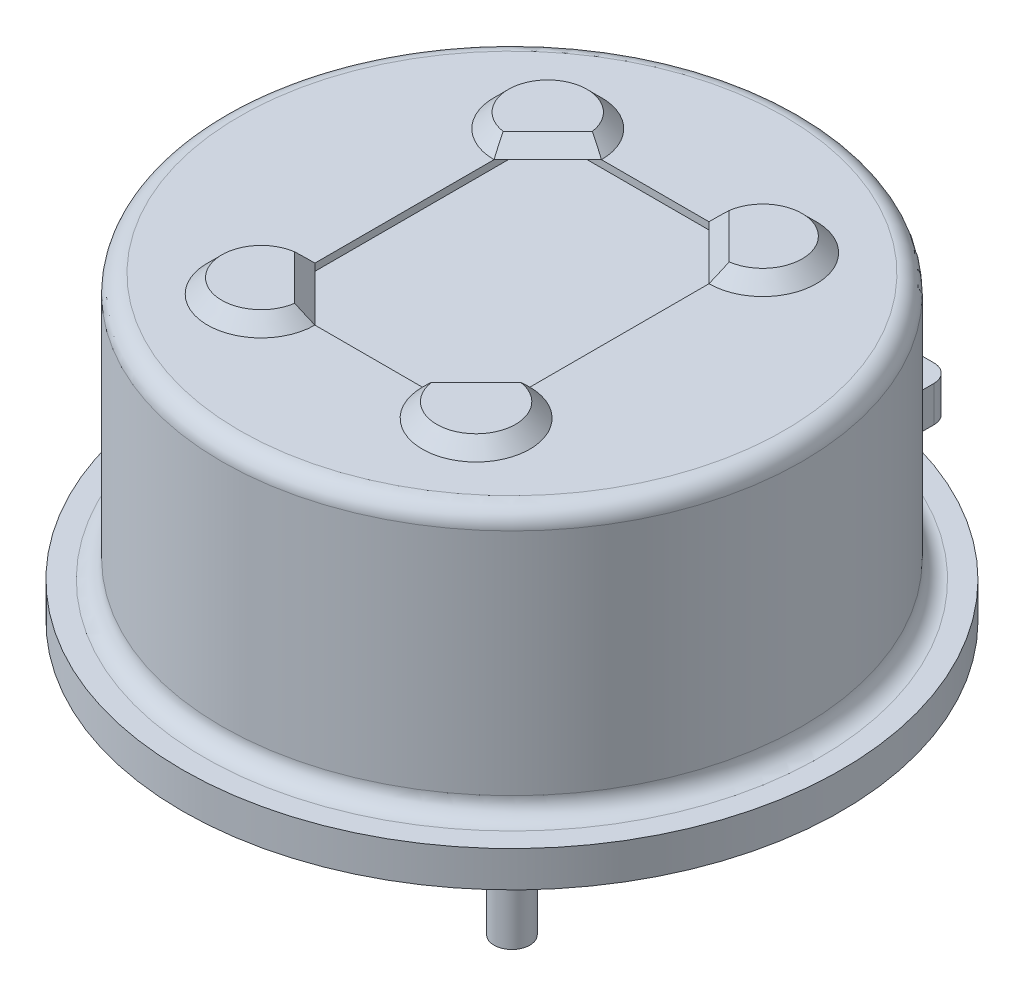
ISO-10303-21;
HEADER;
FILE_DESCRIPTION(('STEP AP214'),'2;1');
FILE_NAME('part.step','',(''),(''),'','','');
FILE_SCHEMA(('AUTOMOTIVE_DESIGN { 1 0 10303 214 1 1 1 1 }'));
ENDSEC;
DATA;
#1=APPLICATION_CONTEXT('core data for automotive mechanical design processes');
#2=APPLICATION_PROTOCOL_DEFINITION('international standard','automotive_design',2000,#1);
#3=PRODUCT_CONTEXT('',#1,'mechanical');
#4=PRODUCT('Part','Part','',(#3));
#5=PRODUCT_RELATED_PRODUCT_CATEGORY('part','',(#4));
#6=PRODUCT_DEFINITION_FORMATION('','',#4);
#7=PRODUCT_DEFINITION_CONTEXT('part definition',#1,'design');
#8=PRODUCT_DEFINITION('design','',#6,#7);
#9=PRODUCT_DEFINITION_SHAPE('','',#8);
#10=(LENGTH_UNIT() NAMED_UNIT(*) SI_UNIT(.MILLI.,.METRE.));
#11=(NAMED_UNIT(*) PLANE_ANGLE_UNIT() SI_UNIT($,.RADIAN.));
#12=(NAMED_UNIT(*) SI_UNIT($,.STERADIAN.) SOLID_ANGLE_UNIT());
#13=UNCERTAINTY_MEASURE_WITH_UNIT(LENGTH_MEASURE(1.E-05),#10,'distance_accuracy_value','');
#14=(GEOMETRIC_REPRESENTATION_CONTEXT(3) GLOBAL_UNCERTAINTY_ASSIGNED_CONTEXT((#13)) GLOBAL_UNIT_ASSIGNED_CONTEXT((#10,
#11,#12)) REPRESENTATION_CONTEXT('',''));
#15=CARTESIAN_POINT('',(0.,0.,0.));
#16=DIRECTION('',(0.,0.,1.));
#17=DIRECTION('',(1.,0.,0.));
#18=AXIS2_PLACEMENT_3D('',#15,#16,#17);
#19=CARTESIAN_POINT('',(0.,0.,0.));
#20=DIRECTION('',(0.,1.,0.));
#21=DIRECTION('',(0.,0.,1.));
#22=AXIS2_PLACEMENT_3D('',#19,#20,#21);
#23=PLANE('',#22);
#24=CARTESIAN_POINT('',(1.79605122421383,0.,1.79605122421383));
#25=DIRECTION('',(0.,1.,0.));
#26=DIRECTION('',(0.,0.,1.));
#27=AXIS2_PLACEMENT_3D('',#24,#25,#26);
#28=CIRCLE('',#27,0.250000000000001);
#29=CARTESIAN_POINT('',(1.79605122421383,0.,2.04605122421383));
#30=VERTEX_POINT('',#29);
#31=EDGE_CURVE('E44',#30,#30,#28,.F.);
#32=ORIENTED_EDGE('',*,*,#31,.F.);
#33=EDGE_LOOP('',(#32));
#34=FACE_BOUND('',#33,.T.);
#35=DIRECTION('',(0.,0.,-1.));
#36=VECTOR('',#35,1.);
#37=CARTESIAN_POINT('',(-0.575,0.,-4.56392101158642));
#38=LINE('',#37,#36);
#39=CARTESIAN_POINT('',(-0.575000000000001,0.,-4.56392101158642));
#40=VERTEX_POINT('',#39);
#41=CARTESIAN_POINT('',(-0.575,0.,-5.31392101158642));
#42=VERTEX_POINT('',#41);
#43=EDGE_CURVE('E193',#40,#42,#38,.T.);
#44=ORIENTED_EDGE('',*,*,#43,.T.);
#45=CARTESIAN_POINT('',(-0.325,0.,-5.31392101158642));
#46=DIRECTION('',(0.,1.,0.));
#47=DIRECTION('',(0.,0.,1.));
#48=AXIS2_PLACEMENT_3D('',#45,#46,#47);
#49=CIRCLE('',#48,0.25);
#50=CARTESIAN_POINT('',(-0.325,0.,-5.56392101158642));
#51=VERTEX_POINT('',#50);
#52=EDGE_CURVE('E373',#42,#51,#49,.F.);
#53=ORIENTED_EDGE('',*,*,#52,.T.);
#54=DIRECTION('',(1.,0.,0.));
#55=VECTOR('',#54,1.);
#56=CARTESIAN_POINT('',(-0.575,0.,-5.56392101158642));
#57=LINE('',#56,#55);
#58=CARTESIAN_POINT('',(0.325,0.,-5.56392101158642));
#59=VERTEX_POINT('',#58);
#60=EDGE_CURVE('E196',#51,#59,#57,.T.);
#61=ORIENTED_EDGE('',*,*,#60,.T.);
#62=CARTESIAN_POINT('',(0.325,0.,-5.31392101158642));
#63=DIRECTION('',(0.,1.,0.));
#64=DIRECTION('',(0.,0.,1.));
#65=AXIS2_PLACEMENT_3D('',#62,#63,#64);
#66=CIRCLE('',#65,0.25);
#67=CARTESIAN_POINT('',(0.575,0.,-5.31392101158642));
#68=VERTEX_POINT('',#67);
#69=EDGE_CURVE('E371',#59,#68,#66,.F.);
#70=ORIENTED_EDGE('',*,*,#69,.T.);
#71=DIRECTION('',(0.,0.,1.));
#72=VECTOR('',#71,1.);
#73=CARTESIAN_POINT('',(0.575,0.,-4.56392101158642));
#74=LINE('',#73,#72);
#75=CARTESIAN_POINT('',(0.575,0.,-4.56392101158642));
#76=VERTEX_POINT('',#75);
#77=EDGE_CURVE('E182',#68,#76,#74,.T.);
#78=ORIENTED_EDGE('',*,*,#77,.T.);
#79=CARTESIAN_POINT('',(0.,0.,0.));
#80=DIRECTION('',(0.,-1.,0.));
#81=DIRECTION('',(0.,0.,-1.));
#82=AXIS2_PLACEMENT_3D('',#79,#80,#81);
#83=CIRCLE('',#82,4.6);
#84=EDGE_CURVE('E174',#76,#40,#83,.T.);
#85=ORIENTED_EDGE('',*,*,#84,.T.);
#86=EDGE_LOOP('',(#44,#53,#61,#70,#78,#85));
#87=FACE_BOUND('',#86,.T.);
#88=CARTESIAN_POINT('',(-1.79605122421383,0.,-1.79605122421383));
#89=DIRECTION('',(0.,1.,0.));
#90=DIRECTION('',(0.,0.,1.));
#91=AXIS2_PLACEMENT_3D('',#88,#89,#90);
#92=CIRCLE('',#91,0.25);
#93=CARTESIAN_POINT('',(-1.79605122421383,0.,-1.54605122421383));
#94=VERTEX_POINT('',#93);
#95=EDGE_CURVE('E396',#94,#94,#92,.F.);
#96=ORIENTED_EDGE('',*,*,#95,.F.);
#97=EDGE_LOOP('',(#96));
#98=FACE_BOUND('',#97,.T.);
#99=CARTESIAN_POINT('',(-1.79605122421383,0.,1.79605122421383));
#100=DIRECTION('',(0.,1.,0.));
#101=DIRECTION('',(0.,0.,1.));
#102=AXIS2_PLACEMENT_3D('',#99,#100,#101);
#103=CIRCLE('',#102,0.25);
#104=CARTESIAN_POINT('',(-1.79605122421383,0.,2.04605122421383));
#105=VERTEX_POINT('',#104);
#106=EDGE_CURVE('E12',#105,#105,#103,.F.);
#107=ORIENTED_EDGE('',*,*,#106,.F.);
#108=EDGE_LOOP('',(#107));
#109=FACE_BOUND('',#108,.T.);
#110=ADVANCED_FACE('F35',(#34,#87,#98,#109),#23,.F.);
#111=CARTESIAN_POINT('',(0.,4.2,0.));
#112=DIRECTION('',(0.,-1.,0.));
#113=DIRECTION('',(0.,0.,-1.));
#114=AXIS2_PLACEMENT_3D('',#111,#112,#113);
#115=CYLINDRICAL_SURFACE('',#114,4.05);
#116=CARTESIAN_POINT('',(0.,3.95,0.));
#117=DIRECTION('',(0.,1.,0.));
#118=DIRECTION('',(0.,0.,1.));
#119=AXIS2_PLACEMENT_3D('',#116,#117,#118);
#120=CIRCLE('',#119,4.05);
#121=CARTESIAN_POINT('',(0.,3.95,4.05));
#122=VERTEX_POINT('',#121);
#123=EDGE_CURVE('E393',#122,#122,#120,.F.);
#124=ORIENTED_EDGE('',*,*,#123,.T.);
#125=EDGE_LOOP('',(#124));
#126=FACE_BOUND('',#125,.T.);
#127=CARTESIAN_POINT('',(0.,0.75,0.));
#128=DIRECTION('',(0.,-1.,0.));
#129=DIRECTION('',(0.,0.,-1.));
#130=AXIS2_PLACEMENT_3D('',#127,#128,#129);
#131=CIRCLE('',#130,4.05);
#132=CARTESIAN_POINT('',(0.,0.75,-4.05));
#133=VERTEX_POINT('',#132);
#134=EDGE_CURVE('E390',#133,#133,#131,.F.);
#135=ORIENTED_EDGE('',*,*,#134,.T.);
#136=EDGE_LOOP('',(#135));
#137=FACE_BOUND('',#136,.T.);
#138=ADVANCED_FACE('F406',(#126,#137),#115,.T.);
#139=CARTESIAN_POINT('',(0.,4.2,0.));
#140=DIRECTION('',(0.,1.,0.));
#141=DIRECTION('',(0.,0.,1.));
#142=AXIS2_PLACEMENT_3D('',#139,#140,#141);
#143=PLANE('',#142);
#144=CARTESIAN_POINT('',(0.,4.2,0.));
#145=DIRECTION('',(0.,1.,0.));
#146=DIRECTION('',(0.,0.,1.));
#147=AXIS2_PLACEMENT_3D('',#144,#145,#146);
#148=CIRCLE('',#147,3.8);
#149=CARTESIAN_POINT('',(0.,4.2,3.8));
#150=VERTEX_POINT('',#149);
#151=EDGE_CURVE('E387',#150,#150,#148,.T.);
#152=ORIENTED_EDGE('',*,*,#151,.T.);
#153=EDGE_LOOP('',(#152));
#154=FACE_BOUND('',#153,.T.);
#155=DIRECTION('',(1.,0.,0.));
#156=VECTOR('',#155,1.);
#157=CARTESIAN_POINT('',(1.5,4.2,2.));
#158=LINE('',#157,#156);
#159=CARTESIAN_POINT('',(-0.750000000000001,4.2,2.));
#160=VERTEX_POINT('',#159);
#161=CARTESIAN_POINT('',(0.75,4.2,2.));
#162=VERTEX_POINT('',#161);
#163=EDGE_CURVE('E252',#160,#162,#158,.T.);
#164=ORIENTED_EDGE('',*,*,#163,.F.);
#165=CARTESIAN_POINT('',(-1.5,4.2,2.));
#166=DIRECTION('',(0.,1.,0.));
#167=DIRECTION('',(0.,0.,1.));
#168=AXIS2_PLACEMENT_3D('',#165,#166,#167);
#169=CIRCLE('',#168,0.75);
#170=CARTESIAN_POINT('',(-1.5,4.2,1.25));
#171=VERTEX_POINT('',#170);
#172=EDGE_CURVE('E202',#171,#160,#169,.T.);
#173=ORIENTED_EDGE('',*,*,#172,.F.);
#174=DIRECTION('',(0.,0.,1.));
#175=VECTOR('',#174,1.);
#176=CARTESIAN_POINT('',(-1.5,4.2,2.));
#177=LINE('',#176,#175);
#178=CARTESIAN_POINT('',(-1.5,4.2,-1.25));
#179=VERTEX_POINT('',#178);
#180=EDGE_CURVE('E229',#179,#171,#177,.T.);
#181=ORIENTED_EDGE('',*,*,#180,.F.);
#182=CARTESIAN_POINT('',(-1.5,4.2,-2.));
#183=DIRECTION('',(0.,1.,0.));
#184=DIRECTION('',(0.,0.,1.));
#185=AXIS2_PLACEMENT_3D('',#182,#183,#184);
#186=CIRCLE('',#185,0.75);
#187=CARTESIAN_POINT('',(-0.75,4.2,-2.));
#188=VERTEX_POINT('',#187);
#189=EDGE_CURVE('E223',#188,#179,#186,.T.);
#190=ORIENTED_EDGE('',*,*,#189,.F.);
#191=DIRECTION('',(-1.,0.,0.));
#192=VECTOR('',#191,1.);
#193=CARTESIAN_POINT('',(1.5,4.2,-2.));
#194=LINE('',#193,#192);
#195=CARTESIAN_POINT('',(0.75,4.2,-2.));
#196=VERTEX_POINT('',#195);
#197=EDGE_CURVE('E260',#196,#188,#194,.T.);
#198=ORIENTED_EDGE('',*,*,#197,.F.);
#199=CARTESIAN_POINT('',(1.5,4.2,-2.));
#200=DIRECTION('',(0.,1.,0.));
#201=DIRECTION('',(0.,0.,1.));
#202=AXIS2_PLACEMENT_3D('',#199,#200,#201);
#203=CIRCLE('',#202,0.75);
#204=CARTESIAN_POINT('',(1.5,4.2,-1.25));
#205=VERTEX_POINT('',#204);
#206=EDGE_CURVE('E217',#205,#196,#203,.T.);
#207=ORIENTED_EDGE('',*,*,#206,.F.);
#208=DIRECTION('',(0.,0.,-1.));
#209=VECTOR('',#208,1.);
#210=CARTESIAN_POINT('',(1.5,4.2,2.));
#211=LINE('',#210,#209);
#212=CARTESIAN_POINT('',(1.5,4.2,1.25));
#213=VERTEX_POINT('',#212);
#214=EDGE_CURVE('E257',#213,#205,#211,.T.);
#215=ORIENTED_EDGE('',*,*,#214,.F.);
#216=CARTESIAN_POINT('',(1.5,4.2,2.));
#217=DIRECTION('',(0.,1.,0.));
#218=DIRECTION('',(0.,0.,1.));
#219=AXIS2_PLACEMENT_3D('',#216,#217,#218);
#220=CIRCLE('',#219,0.75);
#221=EDGE_CURVE('E211',#162,#213,#220,.T.);
#222=ORIENTED_EDGE('',*,*,#221,.F.);
#223=EDGE_LOOP('',(#164,#173,#181,#190,#198,#207,#215,#222));
#224=FACE_BOUND('',#223,.T.);
#225=ADVANCED_FACE('F501',(#154,#224),#143,.T.);
#226=CARTESIAN_POINT('',(-1.5,4.1,2.));
#227=DIRECTION('',(-1.,0.,0.));
#228=DIRECTION('',(0.,0.,1.));
#229=AXIS2_PLACEMENT_3D('',#226,#227,#228);
#230=PLANE('',#229);
#231=CARTESIAN_POINT('',(-1.5,4.2,-2.));
#232=VERTEX_POINT('',#231);
#233=EDGE_CURVE('E244',#232,#179,#177,.T.);
#234=ORIENTED_EDGE('',*,*,#233,.T.);
#235=ORIENTED_EDGE('',*,*,#180,.T.);
#236=DIRECTION('',(0.,0.,-1.));
#237=VECTOR('',#236,1.);
#238=CARTESIAN_POINT('',(-1.5,4.2,2.));
#239=LINE('',#238,#237);
#240=CARTESIAN_POINT('',(-1.5,4.2,2.));
#241=VERTEX_POINT('',#240);
#242=EDGE_CURVE('E209',#241,#171,#239,.T.);
#243=ORIENTED_EDGE('',*,*,#242,.F.);
#244=DIRECTION('',(0.,1.,0.));
#245=VECTOR('',#244,1.);
#246=CARTESIAN_POINT('',(-1.5,4.1,2.));
#247=LINE('',#246,#245);
#248=CARTESIAN_POINT('',(-1.5,4.1,2.));
#249=VERTEX_POINT('',#248);
#250=EDGE_CURVE('E243',#249,#241,#247,.T.);
#251=ORIENTED_EDGE('',*,*,#250,.F.);
#252=DIRECTION('',(0.,0.,1.));
#253=VECTOR('',#252,1.);
#254=CARTESIAN_POINT('',(-1.5,4.1,2.));
#255=LINE('',#254,#253);
#256=CARTESIAN_POINT('',(-1.5,4.1,-2.));
#257=VERTEX_POINT('',#256);
#258=EDGE_CURVE('E230',#257,#249,#255,.T.);
#259=ORIENTED_EDGE('',*,*,#258,.F.);
#260=DIRECTION('',(0.,1.,0.));
#261=VECTOR('',#260,1.);
#262=CARTESIAN_POINT('',(-1.5,4.1,-2.));
#263=LINE('',#262,#261);
#264=EDGE_CURVE('E261',#257,#232,#263,.T.);
#265=ORIENTED_EDGE('',*,*,#264,.T.);
#266=EDGE_LOOP('',(#234,#235,#243,#251,#259,#265));
#267=FACE_BOUND('',#266,.T.);
#268=ADVANCED_FACE('F491',(#267),#230,.F.);
#269=CARTESIAN_POINT('',(1.5,4.1,-2.));
#270=DIRECTION('',(0.,0.,-1.));
#271=DIRECTION('',(-1.,0.,0.));
#272=AXIS2_PLACEMENT_3D('',#269,#270,#271);
#273=PLANE('',#272);
#274=CARTESIAN_POINT('',(1.5,4.2,-2.));
#275=VERTEX_POINT('',#274);
#276=EDGE_CURVE('E234',#275,#196,#194,.T.);
#277=ORIENTED_EDGE('',*,*,#276,.T.);
#278=ORIENTED_EDGE('',*,*,#197,.T.);
#279=EDGE_CURVE('E256',#188,#232,#194,.T.);
#280=ORIENTED_EDGE('',*,*,#279,.T.);
#281=ORIENTED_EDGE('',*,*,#264,.F.);
#282=DIRECTION('',(-1.,0.,0.));
#283=VECTOR('',#282,1.);
#284=CARTESIAN_POINT('',(1.5,4.1,-2.));
#285=LINE('',#284,#283);
#286=CARTESIAN_POINT('',(1.5,4.1,-2.));
#287=VERTEX_POINT('',#286);
#288=EDGE_CURVE('E240',#287,#257,#285,.T.);
#289=ORIENTED_EDGE('',*,*,#288,.F.);
#290=DIRECTION('',(0.,1.,0.));
#291=VECTOR('',#290,1.);
#292=CARTESIAN_POINT('',(1.5,4.1,-2.));
#293=LINE('',#292,#291);
#294=EDGE_CURVE('E265',#287,#275,#293,.T.);
#295=ORIENTED_EDGE('',*,*,#294,.T.);
#296=EDGE_LOOP('',(#277,#278,#280,#281,#289,#295));
#297=FACE_BOUND('',#296,.T.);
#298=ADVANCED_FACE('F487',(#297),#273,.F.);
#299=CARTESIAN_POINT('',(1.5,4.1,2.));
#300=DIRECTION('',(1.,0.,0.));
#301=DIRECTION('',(0.,0.,-1.));
#302=AXIS2_PLACEMENT_3D('',#299,#300,#301);
#303=PLANE('',#302);
#304=CARTESIAN_POINT('',(1.5,4.2,2.));
#305=VERTEX_POINT('',#304);
#306=EDGE_CURVE('E253',#305,#213,#211,.T.);
#307=ORIENTED_EDGE('',*,*,#306,.T.);
#308=ORIENTED_EDGE('',*,*,#214,.T.);
#309=EDGE_CURVE('E251',#205,#275,#211,.T.);
#310=ORIENTED_EDGE('',*,*,#309,.T.);
#311=ORIENTED_EDGE('',*,*,#294,.F.);
#312=DIRECTION('',(0.,0.,-1.));
#313=VECTOR('',#312,1.);
#314=CARTESIAN_POINT('',(1.5,4.1,2.));
#315=LINE('',#314,#313);
#316=CARTESIAN_POINT('',(1.5,4.1,2.));
#317=VERTEX_POINT('',#316);
#318=EDGE_CURVE('E237',#317,#287,#315,.T.);
#319=ORIENTED_EDGE('',*,*,#318,.F.);
#320=DIRECTION('',(0.,1.,0.));
#321=VECTOR('',#320,1.);
#322=CARTESIAN_POINT('',(1.5,4.1,2.));
#323=LINE('',#322,#321);
#324=EDGE_CURVE('E268',#317,#305,#323,.T.);
#325=ORIENTED_EDGE('',*,*,#324,.T.);
#326=EDGE_LOOP('',(#307,#308,#310,#311,#319,#325));
#327=FACE_BOUND('',#326,.T.);
#328=ADVANCED_FACE('F490',(#327),#303,.F.);
#329=CARTESIAN_POINT('',(1.5,4.1,2.));
#330=DIRECTION('',(0.,0.,1.));
#331=DIRECTION('',(1.,0.,0.));
#332=AXIS2_PLACEMENT_3D('',#329,#330,#331);
#333=PLANE('',#332);
#334=EDGE_CURVE('E248',#241,#160,#158,.T.);
#335=ORIENTED_EDGE('',*,*,#334,.T.);
#336=ORIENTED_EDGE('',*,*,#163,.T.);
#337=EDGE_CURVE('E247',#162,#305,#158,.T.);
#338=ORIENTED_EDGE('',*,*,#337,.T.);
#339=ORIENTED_EDGE('',*,*,#324,.F.);
#340=DIRECTION('',(1.,0.,0.));
#341=VECTOR('',#340,1.);
#342=CARTESIAN_POINT('',(1.5,4.1,2.));
#343=LINE('',#342,#341);
#344=EDGE_CURVE('E233',#249,#317,#343,.T.);
#345=ORIENTED_EDGE('',*,*,#344,.F.);
#346=ORIENTED_EDGE('',*,*,#250,.T.);
#347=EDGE_LOOP('',(#335,#336,#338,#339,#345,#346));
#348=FACE_BOUND('',#347,.T.);
#349=ADVANCED_FACE('F485',(#348),#333,.F.);
#350=CARTESIAN_POINT('',(0.,4.1,0.));
#351=DIRECTION('',(0.,1.,0.));
#352=DIRECTION('',(0.,0.,1.));
#353=AXIS2_PLACEMENT_3D('',#350,#351,#352);
#354=PLANE('',#353);
#355=ORIENTED_EDGE('',*,*,#258,.T.);
#356=ORIENTED_EDGE('',*,*,#344,.T.);
#357=ORIENTED_EDGE('',*,*,#318,.T.);
#358=ORIENTED_EDGE('',*,*,#288,.T.);
#359=EDGE_LOOP('',(#355,#356,#357,#358));
#360=FACE_BOUND('',#359,.T.);
#361=ADVANCED_FACE('F478',(#360),#354,.T.);
#362=CARTESIAN_POINT('',(-1.5,4.4,-2.));
#363=DIRECTION('',(0.,1.,0.));
#364=DIRECTION('',(0.,0.,1.));
#365=AXIS2_PLACEMENT_3D('',#362,#363,#364);
#366=PLANE('',#365);
#367=CARTESIAN_POINT('',(-1.5,4.4,-2.));
#368=DIRECTION('',(0.,1.,0.));
#369=DIRECTION('',(0.,0.,1.));
#370=AXIS2_PLACEMENT_3D('',#367,#368,#369);
#371=CIRCLE('',#370,0.550000000000001);
#372=CARTESIAN_POINT('',(-0.955469563867524,4.4,-2.0773731486071));
#373=VERTEX_POINT('',#372);
#374=CARTESIAN_POINT('',(-1.5773731486071,4.4,-1.45546956386752));
#375=VERTEX_POINT('',#374);
#376=EDGE_CURVE('E287',#373,#375,#371,.T.);
#377=ORIENTED_EDGE('',*,*,#376,.T.);
#378=DIRECTION('',(0.707106781186548,0.,-0.707106781186548));
#379=VECTOR('',#378,1.);
#380=CARTESIAN_POINT('',(-0.89142135623731,4.4,-2.14142135623731));
#381=LINE('',#380,#379);
#382=EDGE_CURVE('E289',#375,#373,#381,.T.);
#383=ORIENTED_EDGE('',*,*,#382,.T.);
#384=EDGE_LOOP('',(#377,#383));
#385=FACE_BOUND('',#384,.T.);
#386=ADVANCED_FACE('F475',(#385),#366,.T.);
#387=CARTESIAN_POINT('',(-1.5,4.2,-2.));
#388=DIRECTION('',(0.,1.,0.));
#389=DIRECTION('',(0.,0.,1.));
#390=AXIS2_PLACEMENT_3D('',#387,#388,#389);
#391=PLANE('',#390);
#392=ORIENTED_EDGE('',*,*,#233,.F.);
#393=ORIENTED_EDGE('',*,*,#279,.F.);
#394=DIRECTION('',(0.707106781186548,0.,-0.707106781186548));
#395=VECTOR('',#394,1.);
#396=CARTESIAN_POINT('',(-0.75,4.2,-2.));
#397=LINE('',#396,#395);
#398=EDGE_CURVE('E226',#179,#188,#397,.T.);
#399=ORIENTED_EDGE('',*,*,#398,.F.);
#400=EDGE_LOOP('',(#392,#393,#399));
#401=FACE_BOUND('',#400,.T.);
#402=ADVANCED_FACE('F473',(#401),#391,.F.);
#403=CARTESIAN_POINT('',(1.5,4.2,-2.));
#404=DIRECTION('',(0.,1.,0.));
#405=DIRECTION('',(0.,0.,1.));
#406=AXIS2_PLACEMENT_3D('',#403,#404,#405);
#407=PLANE('',#406);
#408=DIRECTION('',(0.707106781186548,0.,0.707106781186548));
#409=VECTOR('',#408,1.);
#410=CARTESIAN_POINT('',(0.75,4.2,-2.));
#411=LINE('',#410,#409);
#412=EDGE_CURVE('E220',#196,#205,#411,.T.);
#413=ORIENTED_EDGE('',*,*,#412,.F.);
#414=ORIENTED_EDGE('',*,*,#276,.F.);
#415=ORIENTED_EDGE('',*,*,#309,.F.);
#416=EDGE_LOOP('',(#413,#414,#415));
#417=FACE_BOUND('',#416,.T.);
#418=ADVANCED_FACE('F469',(#417),#407,.F.);
#419=CARTESIAN_POINT('',(1.5,4.4,-2.));
#420=DIRECTION('',(0.,1.,0.));
#421=DIRECTION('',(0.,0.,1.));
#422=AXIS2_PLACEMENT_3D('',#419,#420,#421);
#423=PLANE('',#422);
#424=CARTESIAN_POINT('',(1.5,4.4,-2.));
#425=DIRECTION('',(0.,1.,0.));
#426=DIRECTION('',(0.,0.,1.));
#427=AXIS2_PLACEMENT_3D('',#424,#425,#426);
#428=CIRCLE('',#427,0.550000000000002);
#429=CARTESIAN_POINT('',(1.57737314860709,4.4,-1.45546956386752));
#430=VERTEX_POINT('',#429);
#431=CARTESIAN_POINT('',(0.955469563867521,4.4,-2.07737314860709));
#432=VERTEX_POINT('',#431);
#433=EDGE_CURVE('E282',#430,#432,#428,.T.);
#434=ORIENTED_EDGE('',*,*,#433,.T.);
#435=DIRECTION('',(0.707106781186548,0.,0.707106781186548));
#436=VECTOR('',#435,1.);
#437=CARTESIAN_POINT('',(1.64142135623731,4.4,-1.39142135623731));
#438=LINE('',#437,#436);
#439=EDGE_CURVE('E284',#432,#430,#438,.T.);
#440=ORIENTED_EDGE('',*,*,#439,.T.);
#441=EDGE_LOOP('',(#434,#440));
#442=FACE_BOUND('',#441,.T.);
#443=ADVANCED_FACE('F465',(#442),#423,.T.);
#444=CARTESIAN_POINT('',(1.5,4.2,2.));
#445=DIRECTION('',(0.,1.,0.));
#446=DIRECTION('',(0.,0.,1.));
#447=AXIS2_PLACEMENT_3D('',#444,#445,#446);
#448=PLANE('',#447);
#449=DIRECTION('',(-0.707106781186548,0.,0.707106781186548));
#450=VECTOR('',#449,1.);
#451=CARTESIAN_POINT('',(1.5,4.2,1.25));
#452=LINE('',#451,#450);
#453=EDGE_CURVE('E214',#213,#162,#452,.T.);
#454=ORIENTED_EDGE('',*,*,#453,.F.);
#455=ORIENTED_EDGE('',*,*,#306,.F.);
#456=ORIENTED_EDGE('',*,*,#337,.F.);
#457=EDGE_LOOP('',(#454,#455,#456));
#458=FACE_BOUND('',#457,.T.);
#459=ADVANCED_FACE('F461',(#458),#448,.F.);
#460=CARTESIAN_POINT('',(1.5,4.4,2.));
#461=DIRECTION('',(0.,1.,0.));
#462=DIRECTION('',(0.,0.,1.));
#463=AXIS2_PLACEMENT_3D('',#460,#461,#462);
#464=PLANE('',#463);
#465=CARTESIAN_POINT('',(1.5,4.4,2.));
#466=DIRECTION('',(0.,1.,0.));
#467=DIRECTION('',(0.,0.,1.));
#468=AXIS2_PLACEMENT_3D('',#465,#466,#467);
#469=CIRCLE('',#468,0.550000000000002);
#470=CARTESIAN_POINT('',(0.955469563867521,4.4,2.07737314860709));
#471=VERTEX_POINT('',#470);
#472=CARTESIAN_POINT('',(1.57737314860709,4.4,1.45546956386752));
#473=VERTEX_POINT('',#472);
#474=EDGE_CURVE('E277',#471,#473,#469,.T.);
#475=ORIENTED_EDGE('',*,*,#474,.T.);
#476=DIRECTION('',(-0.707106781186548,0.,0.707106781186548));
#477=VECTOR('',#476,1.);
#478=CARTESIAN_POINT('',(0.891421356237308,4.4,2.14142135623731));
#479=LINE('',#478,#477);
#480=EDGE_CURVE('E279',#473,#471,#479,.T.);
#481=ORIENTED_EDGE('',*,*,#480,.T.);
#482=EDGE_LOOP('',(#475,#481));
#483=FACE_BOUND('',#482,.T.);
#484=ADVANCED_FACE('F457',(#483),#464,.T.);
#485=CARTESIAN_POINT('',(-1.5,4.2,2.));
#486=DIRECTION('',(0.,1.,0.));
#487=DIRECTION('',(0.,0.,1.));
#488=AXIS2_PLACEMENT_3D('',#485,#486,#487);
#489=PLANE('',#488);
#490=ORIENTED_EDGE('',*,*,#334,.F.);
#491=ORIENTED_EDGE('',*,*,#242,.T.);
#492=DIRECTION('',(-0.707106781186548,0.,-0.707106781186548));
#493=VECTOR('',#492,1.);
#494=CARTESIAN_POINT('',(-1.5,4.2,1.25));
#495=LINE('',#494,#493);
#496=EDGE_CURVE('E205',#160,#171,#495,.T.);
#497=ORIENTED_EDGE('',*,*,#496,.F.);
#498=EDGE_LOOP('',(#490,#491,#497));
#499=FACE_BOUND('',#498,.T.);
#500=ADVANCED_FACE('F453',(#499),#489,.F.);
#501=CARTESIAN_POINT('',(-1.5,4.4,2.));
#502=DIRECTION('',(0.,1.,0.));
#503=DIRECTION('',(0.,0.,1.));
#504=AXIS2_PLACEMENT_3D('',#501,#502,#503);
#505=PLANE('',#504);
#506=CARTESIAN_POINT('',(-1.5,4.4,2.));
#507=DIRECTION('',(0.,1.,0.));
#508=DIRECTION('',(0.,0.,1.));
#509=AXIS2_PLACEMENT_3D('',#506,#507,#508);
#510=CIRCLE('',#509,0.549999999999999);
#511=CARTESIAN_POINT('',(-1.5773731486071,4.4,1.45546956386752));
#512=VERTEX_POINT('',#511);
#513=CARTESIAN_POINT('',(-0.955469563867525,4.4,2.0773731486071));
#514=VERTEX_POINT('',#513);
#515=EDGE_CURVE('E264',#512,#514,#510,.T.);
#516=ORIENTED_EDGE('',*,*,#515,.T.);
#517=DIRECTION('',(-0.707106781186548,0.,-0.707106781186548));
#518=VECTOR('',#517,1.);
#519=CARTESIAN_POINT('',(-1.64142135623731,4.4,1.39142135623731));
#520=LINE('',#519,#518);
#521=EDGE_CURVE('E274',#514,#512,#520,.T.);
#522=ORIENTED_EDGE('',*,*,#521,.T.);
#523=EDGE_LOOP('',(#516,#522));
#524=FACE_BOUND('',#523,.T.);
#525=ADVANCED_FACE('F450',(#524),#505,.T.);
#526=CARTESIAN_POINT('',(-1.5,4.4,2.));
#527=DIRECTION('',(0.,-1.,0.));
#528=DIRECTION('',(0.,0.,-1.));
#529=AXIS2_PLACEMENT_3D('',#526,#527,#528);
#530=CONICAL_SURFACE('',#529,0.549999999999999,0.785398163397448);
#531=CARTESIAN_POINT('',(-1.5773731486071,4.4,1.45546956386752));
#532=CARTESIAN_POINT('',(-1.57153032965073,4.38349378426202,1.43796906866379));
#533=CARTESIAN_POINT('',(-1.56550896875533,4.36693761964826,1.42057647702152));
#534=CARTESIAN_POINT('',(-1.55315236507141,4.33374297509957,1.38598876418653));
#535=CARTESIAN_POINT('',(-1.54681718019652,4.31710451085875,1.36879360727499));
#536=CARTESIAN_POINT('',(-1.53387439194455,4.28375790502173,1.33457717329314));
#537=CARTESIAN_POINT('',(-1.52726680715465,4.26704976824932,1.31755588445752));
#538=CARTESIAN_POINT('',(-1.51380814033226,4.23356957868965,1.2836664131338));
#539=CARTESIAN_POINT('',(-1.5069570138355,4.2167975147352,1.26679825931718));
#540=CARTESIAN_POINT('',(-1.5,4.2,1.25));
#541=B_SPLINE_CURVE_WITH_KNOTS('',3,(#531,#532,#533,#534,#535,#536,#537,#538,#539,#540),
.UNSPECIFIED.,.F.,.F.,(4,2,2,2,4),(0.,0.0742659562967783,0.14851825811289,0.222765501689113,
0.297026371179287),.UNSPECIFIED.);
#542=EDGE_CURVE('E293',#171,#512,#541,.F.);
#543=ORIENTED_EDGE('',*,*,#542,.F.);
#544=ORIENTED_EDGE('',*,*,#172,.T.);
#545=CARTESIAN_POINT('',(-0.75,4.2,2.));
#546=CARTESIAN_POINT('',(-0.766798259317176,4.2167975147352,2.0069570138355));
#547=CARTESIAN_POINT('',(-0.783666413133803,4.23356957868965,2.01380814033226));
#548=CARTESIAN_POINT('',(-0.817555884457521,4.26704976824932,2.02726680715465));
#549=CARTESIAN_POINT('',(-0.834577173293137,4.28375790502172,2.03387439194454));
#550=CARTESIAN_POINT('',(-0.868793607274992,4.31710451085875,2.04681718019652));
#551=CARTESIAN_POINT('',(-0.885988764186535,4.33374297509957,2.05315236507141));
#552=CARTESIAN_POINT('',(-0.920576477021524,4.36693761964826,2.06550896875533));
#553=CARTESIAN_POINT('',(-0.937969068663791,4.38349378426202,2.07153032965073));
#554=CARTESIAN_POINT('',(-0.955469563867525,4.4,2.0773731486071));
#555=B_SPLINE_CURVE_WITH_KNOTS('',3,(#545,#546,#547,#548,#549,#550,#551,#552,#553,#554),
.UNSPECIFIED.,.F.,.F.,(4,2,2,2,4),(0.,0.0742608694901725,0.148508113066396,0.222760414882508,
0.297026371179286),.UNSPECIFIED.);
#556=EDGE_CURVE('E206',#514,#160,#555,.F.);
#557=ORIENTED_EDGE('',*,*,#556,.F.);
#558=ORIENTED_EDGE('',*,*,#515,.F.);
#559=EDGE_LOOP('',(#543,#544,#557,#558));
#560=FACE_BOUND('',#559,.T.);
#561=ADVANCED_FACE('F305',(#560),#530,.T.);
#562=CARTESIAN_POINT('',(-1.26642135623731,4.4,1.76642135623731));
#563=DIRECTION('',(0.5,0.707106781186548,-0.5));
#564=DIRECTION('',(0.707106781186548,0.,0.707106781186548));
#565=AXIS2_PLACEMENT_3D('',#562,#563,#564);
#566=PLANE('',#565);
#567=ORIENTED_EDGE('',*,*,#556,.T.);
#568=ORIENTED_EDGE('',*,*,#496,.T.);
#569=ORIENTED_EDGE('',*,*,#542,.T.);
#570=ORIENTED_EDGE('',*,*,#521,.F.);
#571=EDGE_LOOP('',(#567,#568,#569,#570));
#572=FACE_BOUND('',#571,.T.);
#573=ADVANCED_FACE('F308',(#572),#566,.T.);
#574=CARTESIAN_POINT('',(1.5,4.4,2.));
#575=DIRECTION('',(0.,-1.,0.));
#576=DIRECTION('',(0.,0.,-1.));
#577=AXIS2_PLACEMENT_3D('',#574,#575,#576);
#578=CONICAL_SURFACE('',#577,0.550000000000002,0.785398163397446);
#579=CARTESIAN_POINT('',(0.955469563867521,4.4,2.07737314860709));
#580=CARTESIAN_POINT('',(0.937969068663787,4.38349378426202,2.07153032965072));
#581=CARTESIAN_POINT('',(0.92057647702152,4.36693761964826,2.06550896875533));
#582=CARTESIAN_POINT('',(0.885988764186531,4.33374297509957,2.05315236507141));
#583=CARTESIAN_POINT('',(0.86879360727499,4.31710451085875,2.04681718019652));
#584=CARTESIAN_POINT('',(0.834577173293135,4.28375790502173,2.03387439194454));
#585=CARTESIAN_POINT('',(0.81755588445752,4.26704976824932,2.02726680715464));
#586=CARTESIAN_POINT('',(0.783666413133802,4.23356957868966,2.01380814033226));
#587=CARTESIAN_POINT('',(0.766798259317175,4.2167975147352,2.0069570138355));
#588=CARTESIAN_POINT('',(0.75,4.2,2.));
#589=B_SPLINE_CURVE_WITH_KNOTS('',3,(#579,#580,#581,#582,#583,#584,#585,#586,#587,#588),
.UNSPECIFIED.,.F.,.F.,(4,2,2,2,4),(0.,0.0742659562967773,0.148518258112889,0.222765501689111,
0.297026371179283),.UNSPECIFIED.);
#590=EDGE_CURVE('E323',#162,#471,#589,.F.);
#591=ORIENTED_EDGE('',*,*,#590,.F.);
#592=ORIENTED_EDGE('',*,*,#221,.T.);
#593=CARTESIAN_POINT('',(1.5,4.2,1.25));
#594=CARTESIAN_POINT('',(1.5069570138355,4.2167975147352,1.26679825931718));
#595=CARTESIAN_POINT('',(1.51380814033226,4.23356957868966,1.2836664131338));
#596=CARTESIAN_POINT('',(1.52726680715464,4.26704976824932,1.31755588445752));
#597=CARTESIAN_POINT('',(1.53387439194454,4.28375790502173,1.33457717329314));
#598=CARTESIAN_POINT('',(1.54681718019652,4.31710451085875,1.36879360727499));
#599=CARTESIAN_POINT('',(1.55315236507141,4.33374297509957,1.38598876418653));
#600=CARTESIAN_POINT('',(1.56550896875533,4.36693761964826,1.42057647702152));
#601=CARTESIAN_POINT('',(1.57153032965072,4.38349378426202,1.43796906866379));
#602=CARTESIAN_POINT('',(1.57737314860709,4.4,1.45546956386752));
#603=B_SPLINE_CURVE_WITH_KNOTS('',3,(#593,#594,#595,#596,#597,#598,#599,#600,#601,#602),
.UNSPECIFIED.,.F.,.F.,(4,2,2,2,4),(0.,0.0742608694901721,0.148508113066394,0.222760414882505,
0.297026371179283),.UNSPECIFIED.);
#604=EDGE_CURVE('E300',#473,#213,#603,.F.);
#605=ORIENTED_EDGE('',*,*,#604,.F.);
#606=ORIENTED_EDGE('',*,*,#474,.F.);
#607=EDGE_LOOP('',(#591,#592,#605,#606));
#608=FACE_BOUND('',#607,.T.);
#609=ADVANCED_FACE('F312',(#608),#578,.T.);
#610=CARTESIAN_POINT('',(1.26642135623731,4.4,1.76642135623731));
#611=DIRECTION('',(-0.500000000000001,0.707106781186546,-0.500000000000001));
#612=DIRECTION('',(0.707106781186548,0.,-0.707106781186548));
#613=AXIS2_PLACEMENT_3D('',#610,#611,#612);
#614=PLANE('',#613);
#615=ORIENTED_EDGE('',*,*,#604,.T.);
#616=ORIENTED_EDGE('',*,*,#453,.T.);
#617=ORIENTED_EDGE('',*,*,#590,.T.);
#618=ORIENTED_EDGE('',*,*,#480,.F.);
#619=EDGE_LOOP('',(#615,#616,#617,#618));
#620=FACE_BOUND('',#619,.T.);
#621=ADVANCED_FACE('F318',(#620),#614,.T.);
#622=CARTESIAN_POINT('',(1.5,4.4,-2.));
#623=DIRECTION('',(0.,-1.,0.));
#624=DIRECTION('',(0.,0.,-1.));
#625=AXIS2_PLACEMENT_3D('',#622,#623,#624);
#626=CONICAL_SURFACE('',#625,0.550000000000002,0.785398163397446);
#627=CARTESIAN_POINT('',(1.57737314860709,4.4,-1.45546956386752));
#628=CARTESIAN_POINT('',(1.57153032965072,4.38349378426202,-1.43796906866379));
#629=CARTESIAN_POINT('',(1.56550896875533,4.36693761964826,-1.42057647702152));
#630=CARTESIAN_POINT('',(1.55315236507141,4.33374297509957,-1.38598876418653));
#631=CARTESIAN_POINT('',(1.54681718019652,4.31710451085875,-1.36879360727499));
#632=CARTESIAN_POINT('',(1.53387439194454,4.28375790502173,-1.33457717329314));
#633=CARTESIAN_POINT('',(1.52726680715464,4.26704976824932,-1.31755588445752));
#634=CARTESIAN_POINT('',(1.51380814033226,4.23356957868966,-1.2836664131338));
#635=CARTESIAN_POINT('',(1.5069570138355,4.2167975147352,-1.26679825931718));
#636=CARTESIAN_POINT('',(1.5,4.2,-1.25));
#637=B_SPLINE_CURVE_WITH_KNOTS('',3,(#627,#628,#629,#630,#631,#632,#633,#634,#635,#636),
.UNSPECIFIED.,.F.,.F.,(4,2,2,2,4),(0.,0.0742659562967779,0.148518258112889,0.222765501689111,
0.297026371179283),.UNSPECIFIED.);
#638=EDGE_CURVE('E332',#205,#430,#637,.F.);
#639=ORIENTED_EDGE('',*,*,#638,.F.);
#640=ORIENTED_EDGE('',*,*,#206,.T.);
#641=CARTESIAN_POINT('',(0.75,4.2,-2.));
#642=CARTESIAN_POINT('',(0.766798259317175,4.2167975147352,-2.0069570138355));
#643=CARTESIAN_POINT('',(0.783666413133802,4.23356957868966,-2.01380814033226));
#644=CARTESIAN_POINT('',(0.81755588445752,4.26704976824932,-2.02726680715465));
#645=CARTESIAN_POINT('',(0.834577173293135,4.28375790502173,-2.03387439194455));
#646=CARTESIAN_POINT('',(0.86879360727499,4.31710451085875,-2.04681718019652));
#647=CARTESIAN_POINT('',(0.885988764186531,4.33374297509957,-2.05315236507141));
#648=CARTESIAN_POINT('',(0.92057647702152,4.36693761964826,-2.06550896875533));
#649=CARTESIAN_POINT('',(0.937969068663787,4.38349378426202,-2.07153032965073));
#650=CARTESIAN_POINT('',(0.955469563867521,4.4,-2.07737314860709));
#651=B_SPLINE_CURVE_WITH_KNOTS('',3,(#641,#642,#643,#644,#645,#646,#647,#648,#649,#650),
.UNSPECIFIED.,.F.,.F.,(4,2,2,2,4),(0.,0.0742608694901723,0.148508113066394,0.222760414882506,
0.297026371179283),.UNSPECIFIED.);
#652=EDGE_CURVE('E338',#432,#196,#651,.F.);
#653=ORIENTED_EDGE('',*,*,#652,.F.);
#654=ORIENTED_EDGE('',*,*,#433,.F.);
#655=EDGE_LOOP('',(#639,#640,#653,#654));
#656=FACE_BOUND('',#655,.T.);
#657=ADVANCED_FACE('F344',(#656),#626,.T.);
#658=CARTESIAN_POINT('',(1.26642135623731,4.4,-1.76642135623731));
#659=DIRECTION('',(-0.500000000000001,0.707106781186546,0.500000000000001));
#660=DIRECTION('',(-0.707106781186548,0.,-0.707106781186548));
#661=AXIS2_PLACEMENT_3D('',#658,#659,#660);
#662=PLANE('',#661);
#663=ORIENTED_EDGE('',*,*,#652,.T.);
#664=ORIENTED_EDGE('',*,*,#412,.T.);
#665=ORIENTED_EDGE('',*,*,#638,.T.);
#666=ORIENTED_EDGE('',*,*,#439,.F.);
#667=EDGE_LOOP('',(#663,#664,#665,#666));
#668=FACE_BOUND('',#667,.T.);
#669=ADVANCED_FACE('F346',(#668),#662,.T.);
#670=CARTESIAN_POINT('',(-1.5,4.4,-2.));
#671=DIRECTION('',(0.,-1.,0.));
#672=DIRECTION('',(0.,0.,-1.));
#673=AXIS2_PLACEMENT_3D('',#670,#671,#672);
#674=CONICAL_SURFACE('',#673,0.550000000000001,0.785398163397446);
#675=CARTESIAN_POINT('',(-0.955469563867524,4.4,-2.0773731486071));
#676=CARTESIAN_POINT('',(-0.93796906866379,4.38349378426202,-2.07153032965073));
#677=CARTESIAN_POINT('',(-0.920576477021523,4.36693761964826,-2.06550896875533));
#678=CARTESIAN_POINT('',(-0.885988764186534,4.33374297509957,-2.05315236507141));
#679=CARTESIAN_POINT('',(-0.868793607274992,4.31710451085875,-2.04681718019652));
#680=CARTESIAN_POINT('',(-0.834577173293137,4.28375790502172,-2.03387439194455));
#681=CARTESIAN_POINT('',(-0.817555884457521,4.26704976824932,-2.02726680715465));
#682=CARTESIAN_POINT('',(-0.783666413133803,4.23356957868965,-2.01380814033226));
#683=CARTESIAN_POINT('',(-0.766798259317176,4.2167975147352,-2.0069570138355));
#684=CARTESIAN_POINT('',(-0.75,4.2,-2.));
#685=B_SPLINE_CURVE_WITH_KNOTS('',3,(#675,#676,#677,#678,#679,#680,#681,#682,#683,#684),
.UNSPECIFIED.,.F.,.F.,(4,2,2,2,4),(0.,0.074265956296778,0.14851825811289,0.222765501689113,
0.297026371179286),.UNSPECIFIED.);
#686=EDGE_CURVE('E173',#188,#373,#685,.F.);
#687=ORIENTED_EDGE('',*,*,#686,.F.);
#688=ORIENTED_EDGE('',*,*,#189,.T.);
#689=CARTESIAN_POINT('',(-1.5,4.2,-1.25));
#690=CARTESIAN_POINT('',(-1.5069570138355,4.2167975147352,-1.26679825931718));
#691=CARTESIAN_POINT('',(-1.51380814033226,4.23356957868965,-1.2836664131338));
#692=CARTESIAN_POINT('',(-1.52726680715465,4.26704976824932,-1.31755588445752));
#693=CARTESIAN_POINT('',(-1.53387439194455,4.28375790502172,-1.33457717329314));
#694=CARTESIAN_POINT('',(-1.54681718019652,4.31710451085875,-1.36879360727499));
#695=CARTESIAN_POINT('',(-1.55315236507141,4.33374297509957,-1.38598876418653));
#696=CARTESIAN_POINT('',(-1.56550896875533,4.36693761964826,-1.42057647702152));
#697=CARTESIAN_POINT('',(-1.57153032965073,4.38349378426202,-1.43796906866379));
#698=CARTESIAN_POINT('',(-1.5773731486071,4.4,-1.45546956386752));
#699=B_SPLINE_CURVE_WITH_KNOTS('',3,(#689,#690,#691,#692,#693,#694,#695,#696,#697,#698),
.UNSPECIFIED.,.F.,.F.,(4,2,2,2,4),(0.,0.0742608694901723,0.148508113066396,0.222760414882508,
0.297026371179286),.UNSPECIFIED.);
#700=EDGE_CURVE('E339',#375,#179,#699,.F.);
#701=ORIENTED_EDGE('',*,*,#700,.F.);
#702=ORIENTED_EDGE('',*,*,#376,.F.);
#703=EDGE_LOOP('',(#687,#688,#701,#702));
#704=FACE_BOUND('',#703,.T.);
#705=ADVANCED_FACE('F350',(#704),#674,.T.);
#706=CARTESIAN_POINT('',(-1.26642135623731,4.4,-1.76642135623731));
#707=DIRECTION('',(0.500000000000001,0.707106781186546,0.500000000000001));
#708=DIRECTION('',(-0.707106781186548,0.,0.707106781186548));
#709=AXIS2_PLACEMENT_3D('',#706,#707,#708);
#710=PLANE('',#709);
#711=ORIENTED_EDGE('',*,*,#700,.T.);
#712=ORIENTED_EDGE('',*,*,#398,.T.);
#713=ORIENTED_EDGE('',*,*,#686,.T.);
#714=ORIENTED_EDGE('',*,*,#382,.F.);
#715=EDGE_LOOP('',(#711,#712,#713,#714));
#716=FACE_BOUND('',#715,.T.);
#717=ADVANCED_FACE('F356',(#716),#710,.T.);
#718=CARTESIAN_POINT('',(0.,0.5,0.));
#719=DIRECTION('',(0.,-1.,0.));
#720=DIRECTION('',(0.,0.,-1.));
#721=AXIS2_PLACEMENT_3D('',#718,#719,#720);
#722=PLANE('',#721);
#723=CARTESIAN_POINT('',(0.,0.5,0.));
#724=DIRECTION('',(0.,-1.,0.));
#725=DIRECTION('',(0.,0.,-1.));
#726=AXIS2_PLACEMENT_3D('',#723,#724,#725);
#727=CIRCLE('',#726,4.3);
#728=CARTESIAN_POINT('',(0.,0.5,-4.3));
#729=VERTEX_POINT('',#728);
#730=EDGE_CURVE('E379',#729,#729,#727,.T.);
#731=ORIENTED_EDGE('',*,*,#730,.T.);
#732=EDGE_LOOP('',(#731));
#733=FACE_BOUND('',#732,.T.);
#734=DIRECTION('',(-1.,0.,0.));
#735=VECTOR('',#734,1.);
#736=CARTESIAN_POINT('',(-0.575,0.5,-5.56392101158642));
#737=LINE('',#736,#735);
#738=CARTESIAN_POINT('',(0.325,0.5,-5.56392101158642));
#739=VERTEX_POINT('',#738);
#740=CARTESIAN_POINT('',(-0.325,0.5,-5.56392101158642));
#741=VERTEX_POINT('',#740);
#742=EDGE_CURVE('E186',#739,#741,#737,.T.);
#743=ORIENTED_EDGE('',*,*,#742,.T.);
#744=CARTESIAN_POINT('',(-0.325,0.5,-5.31392101158642));
#745=DIRECTION('',(0.,-1.,0.));
#746=DIRECTION('',(0.,0.,-1.));
#747=AXIS2_PLACEMENT_3D('',#744,#745,#746);
#748=CIRCLE('',#747,0.25);
#749=CARTESIAN_POINT('',(-0.575,0.5,-5.31392101158642));
#750=VERTEX_POINT('',#749);
#751=EDGE_CURVE('E384',#741,#750,#748,.F.);
#752=ORIENTED_EDGE('',*,*,#751,.T.);
#753=DIRECTION('',(0.,0.,1.));
#754=VECTOR('',#753,1.);
#755=CARTESIAN_POINT('',(-0.575,0.5,-4.56392101158642));
#756=LINE('',#755,#754);
#757=CARTESIAN_POINT('',(-0.575000000000001,0.5,-4.56392101158642));
#758=VERTEX_POINT('',#757);
#759=EDGE_CURVE('E170',#750,#758,#756,.T.);
#760=ORIENTED_EDGE('',*,*,#759,.T.);
#761=CARTESIAN_POINT('',(0.,0.5,0.));
#762=DIRECTION('',(0.,-1.,0.));
#763=DIRECTION('',(0.,0.,-1.));
#764=AXIS2_PLACEMENT_3D('',#761,#762,#763);
#765=CIRCLE('',#764,4.6);
#766=CARTESIAN_POINT('',(0.575,0.5,-4.56392101158642));
#767=VERTEX_POINT('',#766);
#768=EDGE_CURVE('E164',#767,#758,#765,.T.);
#769=ORIENTED_EDGE('',*,*,#768,.F.);
#770=DIRECTION('',(0.,0.,-1.));
#771=VECTOR('',#770,1.);
#772=CARTESIAN_POINT('',(0.575,0.5,-4.56392101158642));
#773=LINE('',#772,#771);
#774=CARTESIAN_POINT('',(0.575,0.5,-5.31392101158642));
#775=VERTEX_POINT('',#774);
#776=EDGE_CURVE('E167',#767,#775,#773,.T.);
#777=ORIENTED_EDGE('',*,*,#776,.T.);
#778=CARTESIAN_POINT('',(0.325,0.5,-5.31392101158642));
#779=DIRECTION('',(0.,-1.,0.));
#780=DIRECTION('',(0.,0.,-1.));
#781=AXIS2_PLACEMENT_3D('',#778,#779,#780);
#782=CIRCLE('',#781,0.25);
#783=EDGE_CURVE('E382',#775,#739,#782,.F.);
#784=ORIENTED_EDGE('',*,*,#783,.T.);
#785=EDGE_LOOP('',(#743,#752,#760,#769,#777,#784));
#786=FACE_BOUND('',#785,.T.);
#787=ADVANCED_FACE('F166',(#733,#786),#722,.F.);
#788=CARTESIAN_POINT('',(0.,0.5,0.));
#789=DIRECTION('',(0.,-1.,0.));
#790=DIRECTION('',(0.,0.,-1.));
#791=AXIS2_PLACEMENT_3D('',#788,#789,#790);
#792=CYLINDRICAL_SURFACE('',#791,4.6);
#793=DIRECTION('',(0.,-1.,0.));
#794=VECTOR('',#793,1.);
#795=CARTESIAN_POINT('',(-0.575,2.02397506541282,-4.56392101158642));
#796=LINE('',#795,#794);
#797=EDGE_CURVE('E181',#758,#40,#796,.T.);
#798=ORIENTED_EDGE('',*,*,#797,.T.);
#799=ORIENTED_EDGE('',*,*,#84,.F.);
#800=DIRECTION('',(0.,-1.,0.));
#801=VECTOR('',#800,1.);
#802=CARTESIAN_POINT('',(0.575,2.02397506541282,-4.56392101158642));
#803=LINE('',#802,#801);
#804=EDGE_CURVE('E178',#767,#76,#803,.T.);
#805=ORIENTED_EDGE('',*,*,#804,.F.);
#806=ORIENTED_EDGE('',*,*,#768,.T.);
#807=EDGE_LOOP('',(#798,#799,#805,#806));
#808=FACE_BOUND('',#807,.T.);
#809=ADVANCED_FACE('F179',(#808),#792,.T.);
#810=CARTESIAN_POINT('',(-0.575,2.02397506541282,-4.56392101158642));
#811=DIRECTION('',(-1.,0.,0.));
#812=DIRECTION('',(0.,0.,1.));
#813=AXIS2_PLACEMENT_3D('',#810,#811,#812);
#814=PLANE('',#813);
#815=ORIENTED_EDGE('',*,*,#759,.F.);
#816=DIRECTION('',(0.,-1.,0.));
#817=VECTOR('',#816,1.);
#818=CARTESIAN_POINT('',(-0.575,2.02397506541282,-5.31392101158642));
#819=LINE('',#818,#817);
#820=EDGE_CURVE('E292',#750,#42,#819,.T.);
#821=ORIENTED_EDGE('',*,*,#820,.T.);
#822=ORIENTED_EDGE('',*,*,#43,.F.);
#823=ORIENTED_EDGE('',*,*,#797,.F.);
#824=EDGE_LOOP('',(#815,#821,#822,#823));
#825=FACE_BOUND('',#824,.T.);
#826=ADVANCED_FACE('F438',(#825),#814,.T.);
#827=CARTESIAN_POINT('',(0.575,2.02397506541282,-4.56392101158642));
#828=DIRECTION('',(1.,0.,0.));
#829=DIRECTION('',(0.,0.,-1.));
#830=AXIS2_PLACEMENT_3D('',#827,#828,#829);
#831=PLANE('',#830);
#832=ORIENTED_EDGE('',*,*,#77,.F.);
#833=DIRECTION('',(0.,-1.,0.));
#834=VECTOR('',#833,1.);
#835=CARTESIAN_POINT('',(0.575,2.02397506541282,-5.31392101158642));
#836=LINE('',#835,#834);
#837=EDGE_CURVE('E51',#68,#775,#836,.F.);
#838=ORIENTED_EDGE('',*,*,#837,.T.);
#839=ORIENTED_EDGE('',*,*,#776,.F.);
#840=ORIENTED_EDGE('',*,*,#804,.T.);
#841=EDGE_LOOP('',(#832,#838,#839,#840));
#842=FACE_BOUND('',#841,.T.);
#843=ADVANCED_FACE('F184',(#842),#831,.T.);
#844=CARTESIAN_POINT('',(-0.575,2.02397506541282,-5.56392101158642));
#845=DIRECTION('',(0.,0.,-1.));
#846=DIRECTION('',(-1.,0.,0.));
#847=AXIS2_PLACEMENT_3D('',#844,#845,#846);
#848=PLANE('',#847);
#849=ORIENTED_EDGE('',*,*,#60,.F.);
#850=DIRECTION('',(0.,-1.,0.));
#851=VECTOR('',#850,1.);
#852=CARTESIAN_POINT('',(-0.325,2.02397506541282,-5.56392101158642));
#853=LINE('',#852,#851);
#854=EDGE_CURVE('E59',#51,#741,#853,.F.);
#855=ORIENTED_EDGE('',*,*,#854,.T.);
#856=ORIENTED_EDGE('',*,*,#742,.F.);
#857=DIRECTION('',(0.,-1.,0.));
#858=VECTOR('',#857,1.);
#859=CARTESIAN_POINT('',(0.325,2.02397506541282,-5.56392101158642));
#860=LINE('',#859,#858);
#861=EDGE_CURVE('E375',#739,#59,#860,.T.);
#862=ORIENTED_EDGE('',*,*,#861,.T.);
#863=EDGE_LOOP('',(#849,#855,#856,#862));
#864=FACE_BOUND('',#863,.T.);
#865=ADVANCED_FACE('F437',(#864),#848,.T.);
#866=CARTESIAN_POINT('',(-0.325,2.02397506541282,-5.31392101158642));
#867=DIRECTION('',(0.,-1.,0.));
#868=DIRECTION('',(0.,0.,-1.));
#869=AXIS2_PLACEMENT_3D('',#866,#867,#868);
#870=CYLINDRICAL_SURFACE('',#869,0.25);
#871=ORIENTED_EDGE('',*,*,#751,.F.);
#872=ORIENTED_EDGE('',*,*,#854,.F.);
#873=ORIENTED_EDGE('',*,*,#52,.F.);
#874=ORIENTED_EDGE('',*,*,#820,.F.);
#875=EDGE_LOOP('',(#871,#872,#873,#874));
#876=FACE_BOUND('',#875,.T.);
#877=ADVANCED_FACE('F441',(#876),#870,.T.);
#878=CARTESIAN_POINT('',(0.325,2.02397506541282,-5.31392101158642));
#879=DIRECTION('',(0.,-1.,0.));
#880=DIRECTION('',(0.,0.,-1.));
#881=AXIS2_PLACEMENT_3D('',#878,#879,#880);
#882=CYLINDRICAL_SURFACE('',#881,0.25);
#883=ORIENTED_EDGE('',*,*,#783,.F.);
#884=ORIENTED_EDGE('',*,*,#837,.F.);
#885=ORIENTED_EDGE('',*,*,#69,.F.);
#886=ORIENTED_EDGE('',*,*,#861,.F.);
#887=EDGE_LOOP('',(#883,#884,#885,#886));
#888=FACE_BOUND('',#887,.T.);
#889=ADVANCED_FACE('F520',(#888),#882,.T.);
#890=CARTESIAN_POINT('',(0.,3.95,0.));
#891=DIRECTION('',(0.,1.,0.));
#892=DIRECTION('',(0.,0.,1.));
#893=AXIS2_PLACEMENT_3D('',#890,#891,#892);
#894=TOROIDAL_SURFACE('',#893,3.8,0.25);
#895=ORIENTED_EDGE('',*,*,#123,.F.);
#896=EDGE_LOOP('',(#895));
#897=FACE_BOUND('',#896,.T.);
#898=ORIENTED_EDGE('',*,*,#151,.F.);
#899=EDGE_LOOP('',(#898));
#900=FACE_BOUND('',#899,.T.);
#901=ADVANCED_FACE('F515',(#897,#900),#894,.T.);
#902=CARTESIAN_POINT('',(0.,0.75,0.));
#903=DIRECTION('',(0.,-1.,0.));
#904=DIRECTION('',(0.,0.,-1.));
#905=AXIS2_PLACEMENT_3D('',#902,#903,#904);
#906=TOROIDAL_SURFACE('',#905,4.3,0.25);
#907=ORIENTED_EDGE('',*,*,#134,.F.);
#908=EDGE_LOOP('',(#907));
#909=FACE_BOUND('',#908,.T.);
#910=ORIENTED_EDGE('',*,*,#730,.F.);
#911=EDGE_LOOP('',(#910));
#912=FACE_BOUND('',#911,.T.);
#913=ADVANCED_FACE('F37',(#909,#912),#906,.F.);
#914=CARTESIAN_POINT('',(-1.79605122421383,-13.2,-1.79605122421383));
#915=DIRECTION('',(0.,1.,0.));
#916=DIRECTION('',(0.,0.,1.));
#917=AXIS2_PLACEMENT_3D('',#914,#915,#916);
#918=CYLINDRICAL_SURFACE('',#917,0.25);
#919=CARTESIAN_POINT('',(-1.79605122421383,-2.,-1.79605122421383));
#920=DIRECTION('',(0.,1.,0.));
#921=DIRECTION('',(0.,0.,1.));
#922=AXIS2_PLACEMENT_3D('',#919,#920,#921);
#923=CIRCLE('',#922,0.25);
#924=CARTESIAN_POINT('',(-1.79605122421383,-2.,-1.54605122421383));
#925=VERTEX_POINT('',#924);
#926=EDGE_CURVE('E190',#925,#925,#923,.T.);
#927=ORIENTED_EDGE('',*,*,#926,.T.);
#928=EDGE_LOOP('',(#927));
#929=FACE_BOUND('',#928,.T.);
#930=ORIENTED_EDGE('',*,*,#95,.T.);
#931=EDGE_LOOP('',(#930));
#932=FACE_BOUND('',#931,.T.);
#933=ADVANCED_FACE('F427',(#929,#932),#918,.T.);
#934=CARTESIAN_POINT('',(1.79605122421383,-13.2,1.79605122421383));
#935=DIRECTION('',(0.,1.,0.));
#936=DIRECTION('',(0.,0.,1.));
#937=AXIS2_PLACEMENT_3D('',#934,#935,#936);
#938=CYLINDRICAL_SURFACE('',#937,0.250000000000001);
#939=CARTESIAN_POINT('',(1.79605122421383,-2.,1.79605122421383));
#940=DIRECTION('',(0.,1.,0.));
#941=DIRECTION('',(0.,0.,1.));
#942=AXIS2_PLACEMENT_3D('',#939,#940,#941);
#943=CIRCLE('',#942,0.250000000000001);
#944=CARTESIAN_POINT('',(1.79605122421383,-2.,2.04605122421383));
#945=VERTEX_POINT('',#944);
#946=EDGE_CURVE('E601',#945,#945,#943,.T.);
#947=ORIENTED_EDGE('',*,*,#946,.T.);
#948=EDGE_LOOP('',(#947));
#949=FACE_BOUND('',#948,.T.);
#950=ORIENTED_EDGE('',*,*,#31,.T.);
#951=EDGE_LOOP('',(#950));
#952=FACE_BOUND('',#951,.T.);
#953=ADVANCED_FACE('F402',(#949,#952),#938,.T.);
#954=CARTESIAN_POINT('',(-1.79605122421383,-13.2,1.79605122421383));
#955=DIRECTION('',(0.,1.,0.));
#956=DIRECTION('',(0.,0.,1.));
#957=AXIS2_PLACEMENT_3D('',#954,#955,#956);
#958=CYLINDRICAL_SURFACE('',#957,0.25);
#959=CARTESIAN_POINT('',(-1.79605122421383,-2.,1.79605122421383));
#960=DIRECTION('',(0.,1.,0.));
#961=DIRECTION('',(0.,0.,1.));
#962=AXIS2_PLACEMENT_3D('',#959,#960,#961);
#963=CIRCLE('',#962,0.25);
#964=CARTESIAN_POINT('',(-1.79605122421383,-2.,2.04605122421383));
#965=VERTEX_POINT('',#964);
#966=EDGE_CURVE('E39',#965,#965,#963,.T.);
#967=ORIENTED_EDGE('',*,*,#966,.T.);
#968=EDGE_LOOP('',(#967));
#969=FACE_BOUND('',#968,.T.);
#970=ORIENTED_EDGE('',*,*,#106,.T.);
#971=EDGE_LOOP('',(#970));
#972=FACE_BOUND('',#971,.T.);
#973=ADVANCED_FACE('F414',(#969,#972),#958,.T.);
#974=CARTESIAN_POINT('',(0.,-2.,0.));
#975=DIRECTION('',(0.,1.,0.));
#976=DIRECTION('',(0.,0.,1.));
#977=AXIS2_PLACEMENT_3D('',#974,#975,#976);
#978=PLANE('',#977);
#979=ORIENTED_EDGE('',*,*,#966,.F.);
#980=EDGE_LOOP('',(#979));
#981=FACE_BOUND('',#980,.T.);
#982=ADVANCED_FACE('F416',(#981),#978,.F.);
#983=ORIENTED_EDGE('',*,*,#946,.F.);
#984=EDGE_LOOP('',(#983));
#985=FACE_BOUND('',#984,.T.);
#986=ADVANCED_FACE('F423',(#985),#978,.F.);
#987=ORIENTED_EDGE('',*,*,#926,.F.);
#988=EDGE_LOOP('',(#987));
#989=FACE_BOUND('',#988,.T.);
#990=ADVANCED_FACE('F426',(#989),#978,.F.);
#991=CLOSED_SHELL('',(#110,#138,#225,#268,#298,#328,#349,#361,#386,#402,#418,#443,#459,#484,
#500,#525,#561,#573,#609,#621,#657,#669,#705,#717,#787,#809,#826,#843,#865,#877,#889,#901,#913,
#933,#953,#973,#982,#986,#990));
#992=MANIFOLD_SOLID_BREP('B2',#991);
#993=ADVANCED_BREP_SHAPE_REPRESENTATION('',(#18,#992),#14);
#994=SHAPE_DEFINITION_REPRESENTATION(#9,#993);
ENDSEC;
END-ISO-10303-21;
